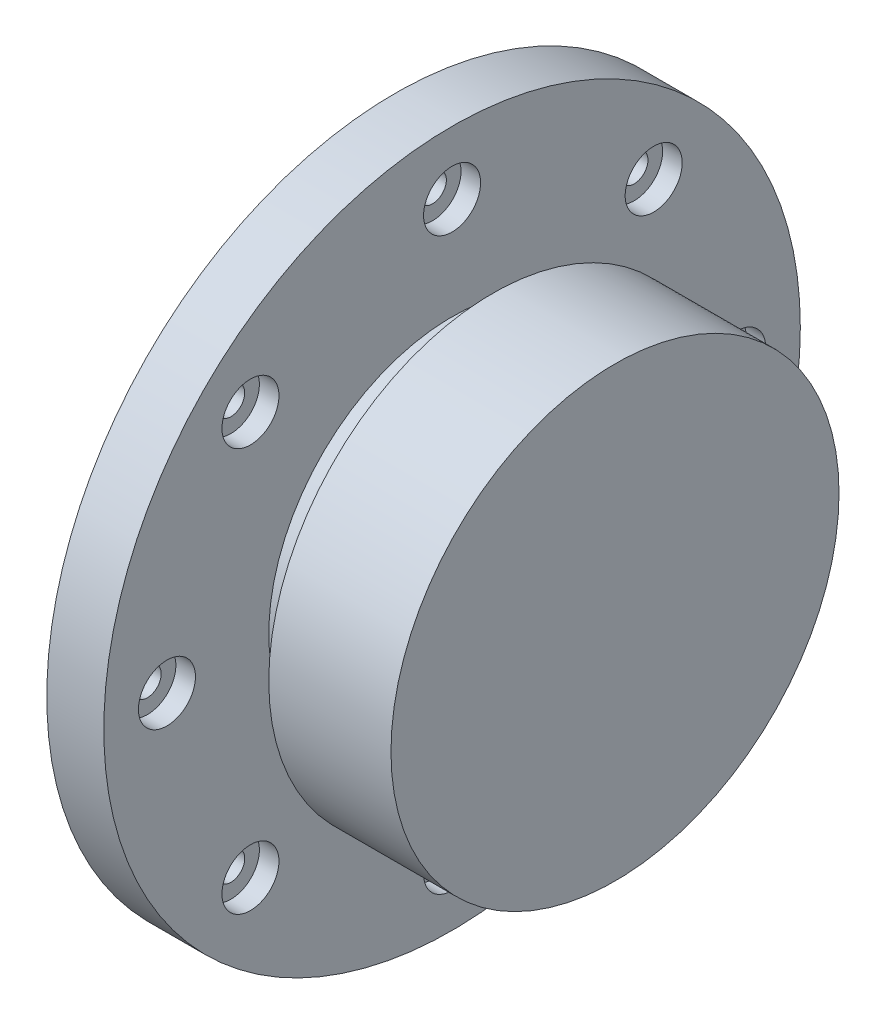
ISO-10303-21;
HEADER;
FILE_DESCRIPTION(('STEP AP214'),'2;1');
FILE_NAME('part.step','',(''),(''),'','','');
FILE_SCHEMA(('AUTOMOTIVE_DESIGN { 1 0 10303 214 1 1 1 1 }'));
ENDSEC;
DATA;
#1=APPLICATION_CONTEXT('core data for automotive mechanical design processes');
#2=APPLICATION_PROTOCOL_DEFINITION('international standard','automotive_design',2000,#1);
#3=PRODUCT_CONTEXT('',#1,'mechanical');
#4=PRODUCT('Part','Part','',(#3));
#5=PRODUCT_RELATED_PRODUCT_CATEGORY('part','',(#4));
#6=PRODUCT_DEFINITION_FORMATION('','',#4);
#7=PRODUCT_DEFINITION_CONTEXT('part definition',#1,'design');
#8=PRODUCT_DEFINITION('design','',#6,#7);
#9=PRODUCT_DEFINITION_SHAPE('','',#8);
#10=(LENGTH_UNIT() NAMED_UNIT(*) SI_UNIT(.MILLI.,.METRE.));
#11=(NAMED_UNIT(*) PLANE_ANGLE_UNIT() SI_UNIT($,.RADIAN.));
#12=(NAMED_UNIT(*) SI_UNIT($,.STERADIAN.) SOLID_ANGLE_UNIT());
#13=UNCERTAINTY_MEASURE_WITH_UNIT(LENGTH_MEASURE(1.E-05),#10,'distance_accuracy_value','');
#14=(GEOMETRIC_REPRESENTATION_CONTEXT(3) GLOBAL_UNCERTAINTY_ASSIGNED_CONTEXT((#13)) GLOBAL_UNIT_ASSIGNED_CONTEXT((#10,
#11,#12)) REPRESENTATION_CONTEXT('',''));
#15=CARTESIAN_POINT('',(0.,0.,0.));
#16=DIRECTION('',(0.,0.,1.));
#17=DIRECTION('',(1.,0.,0.));
#18=AXIS2_PLACEMENT_3D('',#15,#16,#17);
#19=CARTESIAN_POINT('',(3.5,0.,0.));
#20=DIRECTION('',(-1.,0.,0.));
#21=DIRECTION('',(0.,0.,1.));
#22=AXIS2_PLACEMENT_3D('',#19,#20,#21);
#23=CYLINDRICAL_SURFACE('',#22,42.75);
#24=CARTESIAN_POINT('',(3.5,0.,0.));
#25=DIRECTION('',(1.,0.,0.));
#26=DIRECTION('',(0.,0.,-1.));
#27=AXIS2_PLACEMENT_3D('',#24,#25,#26);
#28=CIRCLE('',#27,42.75);
#29=CARTESIAN_POINT('',(3.5,0.,-42.75));
#30=VERTEX_POINT('',#29);
#31=EDGE_CURVE('E10',#30,#30,#28,.T.);
#32=ORIENTED_EDGE('',*,*,#31,.F.);
#33=EDGE_LOOP('',(#32));
#34=FACE_BOUND('',#33,.T.);
#35=CARTESIAN_POINT('',(-3.5,0.,0.));
#36=DIRECTION('',(1.,0.,0.));
#37=DIRECTION('',(0.,0.,-1.));
#38=AXIS2_PLACEMENT_3D('',#35,#36,#37);
#39=CIRCLE('',#38,42.75);
#40=CARTESIAN_POINT('',(-3.5,0.,-42.75));
#41=VERTEX_POINT('',#40);
#42=EDGE_CURVE('E38',#41,#41,#39,.T.);
#43=ORIENTED_EDGE('',*,*,#42,.T.);
#44=EDGE_LOOP('',(#43));
#45=FACE_BOUND('',#44,.T.);
#46=ADVANCED_FACE('F31',(#34,#45),#23,.T.);
#47=CARTESIAN_POINT('',(3.5,0.,0.));
#48=DIRECTION('',(1.,0.,0.));
#49=DIRECTION('',(0.,0.,-1.));
#50=AXIS2_PLACEMENT_3D('',#47,#48,#49);
#51=PLANE('',#50);
#52=CARTESIAN_POINT('',(3.5,0.,0.));
#53=DIRECTION('',(1.,0.,0.));
#54=DIRECTION('',(0.,0.,-1.));
#55=AXIS2_PLACEMENT_3D('',#52,#53,#54);
#56=CIRCLE('',#55,22.5);
#57=CARTESIAN_POINT('',(3.5,0.,-22.5));
#58=VERTEX_POINT('',#57);
#59=EDGE_CURVE('E285',#58,#58,#56,.T.);
#60=ORIENTED_EDGE('',*,*,#59,.F.);
#61=EDGE_LOOP('',(#60));
#62=FACE_BOUND('',#61,.T.);
#63=CARTESIAN_POINT('',(3.5,35.,0.));
#64=DIRECTION('',(1.,0.,0.));
#65=DIRECTION('',(0.,0.,-1.));
#66=AXIS2_PLACEMENT_3D('',#63,#64,#65);
#67=CIRCLE('',#66,3.5);
#68=CARTESIAN_POINT('',(3.5,35.,-3.5));
#69=VERTEX_POINT('',#68);
#70=EDGE_CURVE('E295',#69,#69,#67,.T.);
#71=ORIENTED_EDGE('',*,*,#70,.F.);
#72=EDGE_LOOP('',(#71));
#73=FACE_BOUND('',#72,.T.);
#74=CARTESIAN_POINT('',(3.5,24.7487373415302,-24.7487373415299));
#75=DIRECTION('',(1.,0.,0.));
#76=DIRECTION('',(0.,0.,-1.));
#77=AXIS2_PLACEMENT_3D('',#74,#75,#76);
#78=CIRCLE('',#77,3.5);
#79=CARTESIAN_POINT('',(3.5,24.7487373415302,-28.2487373415299));
#80=VERTEX_POINT('',#79);
#81=EDGE_CURVE('E90',#80,#80,#78,.T.);
#82=ORIENTED_EDGE('',*,*,#81,.F.);
#83=EDGE_LOOP('',(#82));
#84=FACE_BOUND('',#83,.T.);
#85=CARTESIAN_POINT('',(3.5,1.60114976832659E-12,-35.0000000000013));
#86=DIRECTION('',(1.,0.,0.));
#87=DIRECTION('',(0.,0.,-1.));
#88=AXIS2_PLACEMENT_3D('',#85,#86,#87);
#89=CIRCLE('',#88,3.5);
#90=CARTESIAN_POINT('',(3.5,1.60114976832659E-12,-38.5000000000013));
#91=VERTEX_POINT('',#90);
#92=EDGE_CURVE('E77',#91,#91,#89,.T.);
#93=ORIENTED_EDGE('',*,*,#92,.F.);
#94=EDGE_LOOP('',(#93));
#95=FACE_BOUND('',#94,.T.);
#96=CARTESIAN_POINT('',(3.5,-24.7487373415281,-24.7487373415317));
#97=DIRECTION('',(1.,0.,0.));
#98=DIRECTION('',(0.,0.,-1.));
#99=AXIS2_PLACEMENT_3D('',#96,#97,#98);
#100=CIRCLE('',#99,3.5);
#101=CARTESIAN_POINT('',(3.5,-24.7487373415281,-28.2487373415317));
#102=VERTEX_POINT('',#101);
#103=EDGE_CURVE('E73',#102,#102,#100,.T.);
#104=ORIENTED_EDGE('',*,*,#103,.F.);
#105=EDGE_LOOP('',(#104));
#106=FACE_BOUND('',#105,.T.);
#107=CARTESIAN_POINT('',(3.5,-35.,-2.97142069880137E-12));
#108=DIRECTION('',(1.,0.,0.));
#109=DIRECTION('',(0.,0.,-1.));
#110=AXIS2_PLACEMENT_3D('',#107,#108,#109);
#111=CIRCLE('',#110,3.5);
#112=CARTESIAN_POINT('',(3.5,-35.,-3.50000000000297));
#113=VERTEX_POINT('',#112);
#114=EDGE_CURVE('E69',#113,#113,#111,.T.);
#115=ORIENTED_EDGE('',*,*,#114,.F.);
#116=EDGE_LOOP('',(#115));
#117=FACE_BOUND('',#116,.T.);
#118=CARTESIAN_POINT('',(3.5,-24.7487373415302,24.7487373415266));
#119=DIRECTION('',(1.,0.,0.));
#120=DIRECTION('',(0.,0.,-1.));
#121=AXIS2_PLACEMENT_3D('',#118,#119,#120);
#122=CIRCLE('',#121,3.5);
#123=CARTESIAN_POINT('',(3.5,-24.7487373415302,21.2487373415266));
#124=VERTEX_POINT('',#123);
#125=EDGE_CURVE('E64',#124,#124,#122,.T.);
#126=ORIENTED_EDGE('',*,*,#125,.F.);
#127=EDGE_LOOP('',(#126));
#128=FACE_BOUND('',#127,.T.);
#129=CARTESIAN_POINT('',(3.5,-1.4899966131977E-12,34.9999999999985));
#130=DIRECTION('',(1.,0.,0.));
#131=DIRECTION('',(0.,0.,-1.));
#132=AXIS2_PLACEMENT_3D('',#129,#130,#131);
#133=CIRCLE('',#132,3.5);
#134=CARTESIAN_POINT('',(3.5,-1.4899966131977E-12,31.4999999999985));
#135=VERTEX_POINT('',#134);
#136=EDGE_CURVE('E59',#135,#135,#133,.T.);
#137=ORIENTED_EDGE('',*,*,#136,.F.);
#138=EDGE_LOOP('',(#137));
#139=FACE_BOUND('',#138,.T.);
#140=CARTESIAN_POINT('',(3.5,24.7487373415281,24.7487373415287));
#141=DIRECTION('',(1.,0.,0.));
#142=DIRECTION('',(0.,0.,-1.));
#143=AXIS2_PLACEMENT_3D('',#140,#141,#142);
#144=CIRCLE('',#143,3.5);
#145=CARTESIAN_POINT('',(3.5,24.7487373415281,21.2487373415287));
#146=VERTEX_POINT('',#145);
#147=EDGE_CURVE('E54',#146,#146,#144,.T.);
#148=ORIENTED_EDGE('',*,*,#147,.F.);
#149=EDGE_LOOP('',(#148));
#150=FACE_BOUND('',#149,.T.);
#151=ORIENTED_EDGE('',*,*,#31,.T.);
#152=EDGE_LOOP('',(#151));
#153=FACE_BOUND('',#152,.T.);
#154=ADVANCED_FACE('F151',(#62,#73,#84,#95,#106,#117,#128,#139,#150,#153),#51,.T.);
#155=CARTESIAN_POINT('',(-3.5,0.,0.));
#156=DIRECTION('',(1.,0.,0.));
#157=DIRECTION('',(0.,0.,-1.));
#158=AXIS2_PLACEMENT_3D('',#155,#156,#157);
#159=PLANE('',#158);
#160=CARTESIAN_POINT('',(-3.5,35.,0.));
#161=DIRECTION('',(1.,0.,0.));
#162=DIRECTION('',(0.,0.,-1.));
#163=AXIS2_PLACEMENT_3D('',#160,#161,#162);
#164=CIRCLE('',#163,1.7);
#165=CARTESIAN_POINT('',(-3.5,35.,-1.7));
#166=VERTEX_POINT('',#165);
#167=EDGE_CURVE('E34',#166,#166,#164,.T.);
#168=ORIENTED_EDGE('',*,*,#167,.T.);
#169=EDGE_LOOP('',(#168));
#170=FACE_BOUND('',#169,.T.);
#171=CARTESIAN_POINT('',(-3.5,24.7487373415302,-24.7487373415299));
#172=DIRECTION('',(1.,0.,0.));
#173=DIRECTION('',(0.,0.,-1.));
#174=AXIS2_PLACEMENT_3D('',#171,#172,#173);
#175=CIRCLE('',#174,1.69999999999999);
#176=CARTESIAN_POINT('',(-3.5,24.7487373415302,-26.4487373415299));
#177=VERTEX_POINT('',#176);
#178=EDGE_CURVE('E75',#177,#177,#175,.T.);
#179=ORIENTED_EDGE('',*,*,#178,.T.);
#180=EDGE_LOOP('',(#179));
#181=FACE_BOUND('',#180,.T.);
#182=CARTESIAN_POINT('',(-3.5,1.60114976832659E-12,-35.0000000000013));
#183=DIRECTION('',(1.,0.,0.));
#184=DIRECTION('',(0.,0.,-1.));
#185=AXIS2_PLACEMENT_3D('',#182,#183,#184);
#186=CIRCLE('',#185,1.7);
#187=CARTESIAN_POINT('',(-3.5,1.60114976832659E-12,-36.7000000000013));
#188=VERTEX_POINT('',#187);
#189=EDGE_CURVE('E71',#188,#188,#186,.T.);
#190=ORIENTED_EDGE('',*,*,#189,.T.);
#191=EDGE_LOOP('',(#190));
#192=FACE_BOUND('',#191,.T.);
#193=CARTESIAN_POINT('',(-3.5,-24.7487373415281,-24.7487373415317));
#194=DIRECTION('',(1.,0.,0.));
#195=DIRECTION('',(0.,0.,-1.));
#196=AXIS2_PLACEMENT_3D('',#193,#194,#195);
#197=CIRCLE('',#196,1.7);
#198=CARTESIAN_POINT('',(-3.5,-24.7487373415281,-26.4487373415317));
#199=VERTEX_POINT('',#198);
#200=EDGE_CURVE('E66',#199,#199,#197,.T.);
#201=ORIENTED_EDGE('',*,*,#200,.T.);
#202=EDGE_LOOP('',(#201));
#203=FACE_BOUND('',#202,.T.);
#204=CARTESIAN_POINT('',(-3.5,-35.,-2.97142069880137E-12));
#205=DIRECTION('',(1.,0.,0.));
#206=DIRECTION('',(0.,0.,-1.));
#207=AXIS2_PLACEMENT_3D('',#204,#205,#206);
#208=CIRCLE('',#207,1.7);
#209=CARTESIAN_POINT('',(-3.5,-35.,-1.70000000000297));
#210=VERTEX_POINT('',#209);
#211=EDGE_CURVE('E61',#210,#210,#208,.T.);
#212=ORIENTED_EDGE('',*,*,#211,.T.);
#213=EDGE_LOOP('',(#212));
#214=FACE_BOUND('',#213,.T.);
#215=CARTESIAN_POINT('',(-3.5,-24.7487373415302,24.7487373415266));
#216=DIRECTION('',(1.,0.,0.));
#217=DIRECTION('',(0.,0.,-1.));
#218=AXIS2_PLACEMENT_3D('',#215,#216,#217);
#219=CIRCLE('',#218,1.69999999999999);
#220=CARTESIAN_POINT('',(-3.5,-24.7487373415302,23.0487373415266));
#221=VERTEX_POINT('',#220);
#222=EDGE_CURVE('E56',#221,#221,#219,.T.);
#223=ORIENTED_EDGE('',*,*,#222,.T.);
#224=EDGE_LOOP('',(#223));
#225=FACE_BOUND('',#224,.T.);
#226=CARTESIAN_POINT('',(-3.5,-1.4899966131977E-12,34.9999999999985));
#227=DIRECTION('',(1.,0.,0.));
#228=DIRECTION('',(0.,0.,-1.));
#229=AXIS2_PLACEMENT_3D('',#226,#227,#228);
#230=CIRCLE('',#229,1.7);
#231=CARTESIAN_POINT('',(-3.5,-1.4899966131977E-12,33.2999999999985));
#232=VERTEX_POINT('',#231);
#233=EDGE_CURVE('E51',#232,#232,#230,.T.);
#234=ORIENTED_EDGE('',*,*,#233,.T.);
#235=EDGE_LOOP('',(#234));
#236=FACE_BOUND('',#235,.T.);
#237=CARTESIAN_POINT('',(-3.5,24.7487373415281,24.7487373415287));
#238=DIRECTION('',(1.,0.,0.));
#239=DIRECTION('',(0.,0.,-1.));
#240=AXIS2_PLACEMENT_3D('',#237,#238,#239);
#241=CIRCLE('',#240,1.7);
#242=CARTESIAN_POINT('',(-3.5,24.7487373415281,23.0487373415287));
#243=VERTEX_POINT('',#242);
#244=EDGE_CURVE('E43',#243,#243,#241,.T.);
#245=ORIENTED_EDGE('',*,*,#244,.T.);
#246=EDGE_LOOP('',(#245));
#247=FACE_BOUND('',#246,.T.);
#248=ORIENTED_EDGE('',*,*,#42,.F.);
#249=EDGE_LOOP('',(#248));
#250=FACE_BOUND('',#249,.T.);
#251=ADVANCED_FACE('F148',(#170,#181,#192,#203,#214,#225,#236,#247,#250),#159,.F.);
#252=CARTESIAN_POINT('',(3.5,24.7487373415281,24.7487373415287));
#253=DIRECTION('',(1.,0.,0.));
#254=DIRECTION('',(0.,0.,-1.));
#255=AXIS2_PLACEMENT_3D('',#252,#253,#254);
#256=CYLINDRICAL_SURFACE('',#255,1.7);
#257=CARTESIAN_POINT('',(1.1,24.7487373415281,24.7487373415287));
#258=DIRECTION('',(1.,0.,0.));
#259=DIRECTION('',(0.,0.,-1.));
#260=AXIS2_PLACEMENT_3D('',#257,#258,#259);
#261=CIRCLE('',#260,1.7);
#262=CARTESIAN_POINT('',(1.1,24.7487373415281,23.0487373415287));
#263=VERTEX_POINT('',#262);
#264=EDGE_CURVE('E46',#263,#263,#261,.T.);
#265=ORIENTED_EDGE('',*,*,#264,.T.);
#266=EDGE_LOOP('',(#265));
#267=FACE_BOUND('',#266,.T.);
#268=ORIENTED_EDGE('',*,*,#244,.F.);
#269=EDGE_LOOP('',(#268));
#270=FACE_BOUND('',#269,.T.);
#271=ADVANCED_FACE('F134',(#267,#270),#256,.F.);
#272=CARTESIAN_POINT('',(1.1,26.4487373415281,24.7487373415287));
#273=DIRECTION('',(-1.,0.,0.));
#274=DIRECTION('',(0.,0.,1.));
#275=AXIS2_PLACEMENT_3D('',#272,#273,#274);
#276=PLANE('',#275);
#277=ORIENTED_EDGE('',*,*,#264,.F.);
#278=EDGE_LOOP('',(#277));
#279=FACE_BOUND('',#278,.T.);
#280=CARTESIAN_POINT('',(1.1,24.7487373415281,24.7487373415287));
#281=DIRECTION('',(1.,0.,0.));
#282=DIRECTION('',(0.,0.,-1.));
#283=AXIS2_PLACEMENT_3D('',#280,#281,#282);
#284=CIRCLE('',#283,3.5);
#285=CARTESIAN_POINT('',(1.1,24.7487373415281,21.2487373415287));
#286=VERTEX_POINT('',#285);
#287=EDGE_CURVE('E127',#286,#286,#284,.T.);
#288=ORIENTED_EDGE('',*,*,#287,.T.);
#289=EDGE_LOOP('',(#288));
#290=FACE_BOUND('',#289,.T.);
#291=ADVANCED_FACE('F137',(#279,#290),#276,.F.);
#292=CARTESIAN_POINT('',(3.5,24.7487373415281,24.7487373415287));
#293=DIRECTION('',(1.,0.,0.));
#294=DIRECTION('',(0.,0.,-1.));
#295=AXIS2_PLACEMENT_3D('',#292,#293,#294);
#296=CYLINDRICAL_SURFACE('',#295,3.5);
#297=ORIENTED_EDGE('',*,*,#287,.F.);
#298=EDGE_LOOP('',(#297));
#299=FACE_BOUND('',#298,.T.);
#300=ORIENTED_EDGE('',*,*,#147,.T.);
#301=EDGE_LOOP('',(#300));
#302=FACE_BOUND('',#301,.T.);
#303=ADVANCED_FACE('F139',(#299,#302),#296,.F.);
#304=CARTESIAN_POINT('',(3.5,-1.4899966131977E-12,34.9999999999985));
#305=DIRECTION('',(1.,0.,0.));
#306=DIRECTION('',(0.,0.,-1.));
#307=AXIS2_PLACEMENT_3D('',#304,#305,#306);
#308=CYLINDRICAL_SURFACE('',#307,1.7);
#309=CARTESIAN_POINT('',(1.1,-1.4899966131977E-12,34.9999999999985));
#310=DIRECTION('',(1.,0.,0.));
#311=DIRECTION('',(0.,0.,-1.));
#312=AXIS2_PLACEMENT_3D('',#309,#310,#311);
#313=CIRCLE('',#312,1.7);
#314=CARTESIAN_POINT('',(1.1,-1.4899966131977E-12,33.2999999999985));
#315=VERTEX_POINT('',#314);
#316=EDGE_CURVE('E55',#315,#315,#313,.T.);
#317=ORIENTED_EDGE('',*,*,#316,.T.);
#318=EDGE_LOOP('',(#317));
#319=FACE_BOUND('',#318,.T.);
#320=ORIENTED_EDGE('',*,*,#233,.F.);
#321=EDGE_LOOP('',(#320));
#322=FACE_BOUND('',#321,.T.);
#323=ADVANCED_FACE('F145',(#319,#322),#308,.F.);
#324=CARTESIAN_POINT('',(1.1,1.69999999999851,34.9999999999985));
#325=DIRECTION('',(-1.,0.,0.));
#326=DIRECTION('',(0.,0.,1.));
#327=AXIS2_PLACEMENT_3D('',#324,#325,#326);
#328=PLANE('',#327);
#329=ORIENTED_EDGE('',*,*,#316,.F.);
#330=EDGE_LOOP('',(#329));
#331=FACE_BOUND('',#330,.T.);
#332=CARTESIAN_POINT('',(1.1,-1.4899966131977E-12,34.9999999999985));
#333=DIRECTION('',(1.,0.,0.));
#334=DIRECTION('',(0.,0.,-1.));
#335=AXIS2_PLACEMENT_3D('',#332,#333,#334);
#336=CIRCLE('',#335,3.5);
#337=CARTESIAN_POINT('',(1.1,-1.4899966131977E-12,31.4999999999985));
#338=VERTEX_POINT('',#337);
#339=EDGE_CURVE('E121',#338,#338,#336,.T.);
#340=ORIENTED_EDGE('',*,*,#339,.T.);
#341=EDGE_LOOP('',(#340));
#342=FACE_BOUND('',#341,.T.);
#343=ADVANCED_FACE('F181',(#331,#342),#328,.F.);
#344=CARTESIAN_POINT('',(3.5,-1.4899966131977E-12,34.9999999999985));
#345=DIRECTION('',(1.,0.,0.));
#346=DIRECTION('',(0.,0.,-1.));
#347=AXIS2_PLACEMENT_3D('',#344,#345,#346);
#348=CYLINDRICAL_SURFACE('',#347,3.5);
#349=ORIENTED_EDGE('',*,*,#339,.F.);
#350=EDGE_LOOP('',(#349));
#351=FACE_BOUND('',#350,.T.);
#352=ORIENTED_EDGE('',*,*,#136,.T.);
#353=EDGE_LOOP('',(#352));
#354=FACE_BOUND('',#353,.T.);
#355=ADVANCED_FACE('F187',(#351,#354),#348,.F.);
#356=CARTESIAN_POINT('',(3.5,-24.7487373415302,24.7487373415266));
#357=DIRECTION('',(1.,0.,0.));
#358=DIRECTION('',(0.,0.,-1.));
#359=AXIS2_PLACEMENT_3D('',#356,#357,#358);
#360=CYLINDRICAL_SURFACE('',#359,1.69999999999999);
#361=CARTESIAN_POINT('',(1.1,-24.7487373415302,24.7487373415266));
#362=DIRECTION('',(1.,0.,0.));
#363=DIRECTION('',(0.,0.,-1.));
#364=AXIS2_PLACEMENT_3D('',#361,#362,#363);
#365=CIRCLE('',#364,1.7);
#366=CARTESIAN_POINT('',(1.1,-24.7487373415302,23.0487373415266));
#367=VERTEX_POINT('',#366);
#368=EDGE_CURVE('E60',#367,#367,#365,.T.);
#369=ORIENTED_EDGE('',*,*,#368,.T.);
#370=EDGE_LOOP('',(#369));
#371=FACE_BOUND('',#370,.T.);
#372=ORIENTED_EDGE('',*,*,#222,.F.);
#373=EDGE_LOOP('',(#372));
#374=FACE_BOUND('',#373,.T.);
#375=ADVANCED_FACE('F193',(#371,#374),#360,.F.);
#376=CARTESIAN_POINT('',(1.1,-23.0487373415302,24.7487373415266));
#377=DIRECTION('',(-1.,0.,0.));
#378=DIRECTION('',(0.,0.,1.));
#379=AXIS2_PLACEMENT_3D('',#376,#377,#378);
#380=PLANE('',#379);
#381=ORIENTED_EDGE('',*,*,#368,.F.);
#382=EDGE_LOOP('',(#381));
#383=FACE_BOUND('',#382,.T.);
#384=CARTESIAN_POINT('',(1.1,-24.7487373415302,24.7487373415266));
#385=DIRECTION('',(1.,0.,0.));
#386=DIRECTION('',(0.,0.,-1.));
#387=AXIS2_PLACEMENT_3D('',#384,#385,#386);
#388=CIRCLE('',#387,3.5);
#389=CARTESIAN_POINT('',(1.1,-24.7487373415302,21.2487373415266));
#390=VERTEX_POINT('',#389);
#391=EDGE_CURVE('E114',#390,#390,#388,.T.);
#392=ORIENTED_EDGE('',*,*,#391,.T.);
#393=EDGE_LOOP('',(#392));
#394=FACE_BOUND('',#393,.T.);
#395=ADVANCED_FACE('F197',(#383,#394),#380,.F.);
#396=CARTESIAN_POINT('',(3.5,-24.7487373415302,24.7487373415266));
#397=DIRECTION('',(1.,0.,0.));
#398=DIRECTION('',(0.,0.,-1.));
#399=AXIS2_PLACEMENT_3D('',#396,#397,#398);
#400=CYLINDRICAL_SURFACE('',#399,3.5);
#401=ORIENTED_EDGE('',*,*,#391,.F.);
#402=EDGE_LOOP('',(#401));
#403=FACE_BOUND('',#402,.T.);
#404=ORIENTED_EDGE('',*,*,#125,.T.);
#405=EDGE_LOOP('',(#404));
#406=FACE_BOUND('',#405,.T.);
#407=ADVANCED_FACE('F201',(#403,#406),#400,.F.);
#408=CARTESIAN_POINT('',(3.5,-35.,-2.97142069880137E-12));
#409=DIRECTION('',(1.,0.,0.));
#410=DIRECTION('',(0.,0.,-1.));
#411=AXIS2_PLACEMENT_3D('',#408,#409,#410);
#412=CYLINDRICAL_SURFACE('',#411,1.7);
#413=CARTESIAN_POINT('',(1.1,-35.,-2.97142069880137E-12));
#414=DIRECTION('',(1.,0.,0.));
#415=DIRECTION('',(0.,0.,-1.));
#416=AXIS2_PLACEMENT_3D('',#413,#414,#415);
#417=CIRCLE('',#416,1.7);
#418=CARTESIAN_POINT('',(1.1,-35.,-1.70000000000297));
#419=VERTEX_POINT('',#418);
#420=EDGE_CURVE('E65',#419,#419,#417,.T.);
#421=ORIENTED_EDGE('',*,*,#420,.T.);
#422=EDGE_LOOP('',(#421));
#423=FACE_BOUND('',#422,.T.);
#424=ORIENTED_EDGE('',*,*,#211,.F.);
#425=EDGE_LOOP('',(#424));
#426=FACE_BOUND('',#425,.T.);
#427=ADVANCED_FACE('F205',(#423,#426),#412,.F.);
#428=CARTESIAN_POINT('',(1.1,-33.3,-2.97142069880137E-12));
#429=DIRECTION('',(-1.,0.,0.));
#430=DIRECTION('',(0.,0.,1.));
#431=AXIS2_PLACEMENT_3D('',#428,#429,#430);
#432=PLANE('',#431);
#433=ORIENTED_EDGE('',*,*,#420,.F.);
#434=EDGE_LOOP('',(#433));
#435=FACE_BOUND('',#434,.T.);
#436=CARTESIAN_POINT('',(1.1,-35.,-2.97142069880137E-12));
#437=DIRECTION('',(1.,0.,0.));
#438=DIRECTION('',(0.,0.,-1.));
#439=AXIS2_PLACEMENT_3D('',#436,#437,#438);
#440=CIRCLE('',#439,3.5);
#441=CARTESIAN_POINT('',(1.1,-35.,-3.50000000000297));
#442=VERTEX_POINT('',#441);
#443=EDGE_CURVE('E107',#442,#442,#440,.T.);
#444=ORIENTED_EDGE('',*,*,#443,.T.);
#445=EDGE_LOOP('',(#444));
#446=FACE_BOUND('',#445,.T.);
#447=ADVANCED_FACE('F209',(#435,#446),#432,.F.);
#448=CARTESIAN_POINT('',(3.5,-35.,-2.97142069880137E-12));
#449=DIRECTION('',(1.,0.,0.));
#450=DIRECTION('',(0.,0.,-1.));
#451=AXIS2_PLACEMENT_3D('',#448,#449,#450);
#452=CYLINDRICAL_SURFACE('',#451,3.5);
#453=ORIENTED_EDGE('',*,*,#443,.F.);
#454=EDGE_LOOP('',(#453));
#455=FACE_BOUND('',#454,.T.);
#456=ORIENTED_EDGE('',*,*,#114,.T.);
#457=EDGE_LOOP('',(#456));
#458=FACE_BOUND('',#457,.T.);
#459=ADVANCED_FACE('F213',(#455,#458),#452,.F.);
#460=CARTESIAN_POINT('',(3.5,-24.7487373415281,-24.7487373415317));
#461=DIRECTION('',(1.,0.,0.));
#462=DIRECTION('',(0.,0.,-1.));
#463=AXIS2_PLACEMENT_3D('',#460,#461,#462);
#464=CYLINDRICAL_SURFACE('',#463,1.7);
#465=CARTESIAN_POINT('',(1.1,-24.7487373415281,-24.7487373415317));
#466=DIRECTION('',(1.,0.,0.));
#467=DIRECTION('',(0.,0.,-1.));
#468=AXIS2_PLACEMENT_3D('',#465,#466,#467);
#469=CIRCLE('',#468,1.7);
#470=CARTESIAN_POINT('',(1.1,-24.7487373415281,-26.4487373415317));
#471=VERTEX_POINT('',#470);
#472=EDGE_CURVE('E70',#471,#471,#469,.T.);
#473=ORIENTED_EDGE('',*,*,#472,.T.);
#474=EDGE_LOOP('',(#473));
#475=FACE_BOUND('',#474,.T.);
#476=ORIENTED_EDGE('',*,*,#200,.F.);
#477=EDGE_LOOP('',(#476));
#478=FACE_BOUND('',#477,.T.);
#479=ADVANCED_FACE('F217',(#475,#478),#464,.F.);
#480=CARTESIAN_POINT('',(1.1,-23.0487373415281,-24.7487373415317));
#481=DIRECTION('',(-1.,0.,0.));
#482=DIRECTION('',(0.,0.,1.));
#483=AXIS2_PLACEMENT_3D('',#480,#481,#482);
#484=PLANE('',#483);
#485=ORIENTED_EDGE('',*,*,#472,.F.);
#486=EDGE_LOOP('',(#485));
#487=FACE_BOUND('',#486,.T.);
#488=CARTESIAN_POINT('',(1.1,-24.7487373415281,-24.7487373415317));
#489=DIRECTION('',(1.,0.,0.));
#490=DIRECTION('',(0.,0.,-1.));
#491=AXIS2_PLACEMENT_3D('',#488,#489,#490);
#492=CIRCLE('',#491,3.5);
#493=CARTESIAN_POINT('',(1.1,-24.7487373415281,-28.2487373415317));
#494=VERTEX_POINT('',#493);
#495=EDGE_CURVE('E100',#494,#494,#492,.T.);
#496=ORIENTED_EDGE('',*,*,#495,.T.);
#497=EDGE_LOOP('',(#496));
#498=FACE_BOUND('',#497,.T.);
#499=ADVANCED_FACE('F221',(#487,#498),#484,.F.);
#500=CARTESIAN_POINT('',(3.5,-24.7487373415281,-24.7487373415317));
#501=DIRECTION('',(1.,0.,0.));
#502=DIRECTION('',(0.,0.,-1.));
#503=AXIS2_PLACEMENT_3D('',#500,#501,#502);
#504=CYLINDRICAL_SURFACE('',#503,3.5);
#505=ORIENTED_EDGE('',*,*,#495,.F.);
#506=EDGE_LOOP('',(#505));
#507=FACE_BOUND('',#506,.T.);
#508=ORIENTED_EDGE('',*,*,#103,.T.);
#509=EDGE_LOOP('',(#508));
#510=FACE_BOUND('',#509,.T.);
#511=ADVANCED_FACE('F225',(#507,#510),#504,.F.);
#512=CARTESIAN_POINT('',(3.5,1.60114976832659E-12,-35.0000000000013));
#513=DIRECTION('',(1.,0.,0.));
#514=DIRECTION('',(0.,0.,-1.));
#515=AXIS2_PLACEMENT_3D('',#512,#513,#514);
#516=CYLINDRICAL_SURFACE('',#515,1.7);
#517=CARTESIAN_POINT('',(1.1,1.60114976832659E-12,-35.0000000000013));
#518=DIRECTION('',(1.,0.,0.));
#519=DIRECTION('',(0.,0.,-1.));
#520=AXIS2_PLACEMENT_3D('',#517,#518,#519);
#521=CIRCLE('',#520,1.7);
#522=CARTESIAN_POINT('',(1.1,1.60114976832659E-12,-36.7000000000013));
#523=VERTEX_POINT('',#522);
#524=EDGE_CURVE('E74',#523,#523,#521,.T.);
#525=ORIENTED_EDGE('',*,*,#524,.T.);
#526=EDGE_LOOP('',(#525));
#527=FACE_BOUND('',#526,.T.);
#528=ORIENTED_EDGE('',*,*,#189,.F.);
#529=EDGE_LOOP('',(#528));
#530=FACE_BOUND('',#529,.T.);
#531=ADVANCED_FACE('F229',(#527,#530),#516,.F.);
#532=CARTESIAN_POINT('',(1.1,1.7000000000016,-35.0000000000013));
#533=DIRECTION('',(-1.,0.,0.));
#534=DIRECTION('',(0.,0.,1.));
#535=AXIS2_PLACEMENT_3D('',#532,#533,#534);
#536=PLANE('',#535);
#537=ORIENTED_EDGE('',*,*,#524,.F.);
#538=EDGE_LOOP('',(#537));
#539=FACE_BOUND('',#538,.T.);
#540=CARTESIAN_POINT('',(1.1,1.60114976832659E-12,-35.0000000000013));
#541=DIRECTION('',(1.,0.,0.));
#542=DIRECTION('',(0.,0.,-1.));
#543=AXIS2_PLACEMENT_3D('',#540,#541,#542);
#544=CIRCLE('',#543,3.5);
#545=CARTESIAN_POINT('',(1.1,1.60114976832659E-12,-38.5000000000013));
#546=VERTEX_POINT('',#545);
#547=EDGE_CURVE('E82',#546,#546,#544,.T.);
#548=ORIENTED_EDGE('',*,*,#547,.T.);
#549=EDGE_LOOP('',(#548));
#550=FACE_BOUND('',#549,.T.);
#551=ADVANCED_FACE('F233',(#539,#550),#536,.F.);
#552=CARTESIAN_POINT('',(3.5,1.60114976832659E-12,-35.0000000000013));
#553=DIRECTION('',(1.,0.,0.));
#554=DIRECTION('',(0.,0.,-1.));
#555=AXIS2_PLACEMENT_3D('',#552,#553,#554);
#556=CYLINDRICAL_SURFACE('',#555,3.5);
#557=ORIENTED_EDGE('',*,*,#547,.F.);
#558=EDGE_LOOP('',(#557));
#559=FACE_BOUND('',#558,.T.);
#560=ORIENTED_EDGE('',*,*,#92,.T.);
#561=EDGE_LOOP('',(#560));
#562=FACE_BOUND('',#561,.T.);
#563=ADVANCED_FACE('F237',(#559,#562),#556,.F.);
#564=CARTESIAN_POINT('',(3.5,24.7487373415302,-24.7487373415299));
#565=DIRECTION('',(1.,0.,0.));
#566=DIRECTION('',(0.,0.,-1.));
#567=AXIS2_PLACEMENT_3D('',#564,#565,#566);
#568=CYLINDRICAL_SURFACE('',#567,1.69999999999999);
#569=CARTESIAN_POINT('',(1.1,24.7487373415302,-24.7487373415299));
#570=DIRECTION('',(1.,0.,0.));
#571=DIRECTION('',(0.,0.,-1.));
#572=AXIS2_PLACEMENT_3D('',#569,#570,#571);
#573=CIRCLE('',#572,1.7);
#574=CARTESIAN_POINT('',(1.1,24.7487373415302,-26.4487373415299));
#575=VERTEX_POINT('',#574);
#576=EDGE_CURVE('E78',#575,#575,#573,.T.);
#577=ORIENTED_EDGE('',*,*,#576,.T.);
#578=EDGE_LOOP('',(#577));
#579=FACE_BOUND('',#578,.T.);
#580=ORIENTED_EDGE('',*,*,#178,.F.);
#581=EDGE_LOOP('',(#580));
#582=FACE_BOUND('',#581,.T.);
#583=ADVANCED_FACE('F241',(#579,#582),#568,.F.);
#584=CARTESIAN_POINT('',(1.1,26.4487373415302,-24.7487373415299));
#585=DIRECTION('',(-1.,0.,0.));
#586=DIRECTION('',(0.,0.,1.));
#587=AXIS2_PLACEMENT_3D('',#584,#585,#586);
#588=PLANE('',#587);
#589=ORIENTED_EDGE('',*,*,#576,.F.);
#590=EDGE_LOOP('',(#589));
#591=FACE_BOUND('',#590,.T.);
#592=CARTESIAN_POINT('',(1.1,24.7487373415302,-24.7487373415299));
#593=DIRECTION('',(1.,0.,0.));
#594=DIRECTION('',(0.,0.,-1.));
#595=AXIS2_PLACEMENT_3D('',#592,#593,#594);
#596=CIRCLE('',#595,3.5);
#597=CARTESIAN_POINT('',(1.1,24.7487373415302,-28.2487373415299));
#598=VERTEX_POINT('',#597);
#599=EDGE_CURVE('E85',#598,#598,#596,.T.);
#600=ORIENTED_EDGE('',*,*,#599,.T.);
#601=EDGE_LOOP('',(#600));
#602=FACE_BOUND('',#601,.T.);
#603=ADVANCED_FACE('F245',(#591,#602),#588,.F.);
#604=CARTESIAN_POINT('',(3.5,24.7487373415302,-24.7487373415299));
#605=DIRECTION('',(1.,0.,0.));
#606=DIRECTION('',(0.,0.,-1.));
#607=AXIS2_PLACEMENT_3D('',#604,#605,#606);
#608=CYLINDRICAL_SURFACE('',#607,3.5);
#609=ORIENTED_EDGE('',*,*,#599,.F.);
#610=EDGE_LOOP('',(#609));
#611=FACE_BOUND('',#610,.T.);
#612=ORIENTED_EDGE('',*,*,#81,.T.);
#613=EDGE_LOOP('',(#612));
#614=FACE_BOUND('',#613,.T.);
#615=ADVANCED_FACE('F248',(#611,#614),#608,.F.);
#616=CARTESIAN_POINT('',(3.5,35.,0.));
#617=DIRECTION('',(1.,0.,0.));
#618=DIRECTION('',(0.,0.,-1.));
#619=AXIS2_PLACEMENT_3D('',#616,#617,#618);
#620=CYLINDRICAL_SURFACE('',#619,1.7);
#621=CARTESIAN_POINT('',(1.1,35.,0.));
#622=DIRECTION('',(1.,0.,0.));
#623=DIRECTION('',(0.,0.,-1.));
#624=AXIS2_PLACEMENT_3D('',#621,#622,#623);
#625=CIRCLE('',#624,1.7);
#626=CARTESIAN_POINT('',(1.1,35.,-1.7));
#627=VERTEX_POINT('',#626);
#628=EDGE_CURVE('E302',#627,#627,#625,.T.);
#629=ORIENTED_EDGE('',*,*,#628,.T.);
#630=EDGE_LOOP('',(#629));
#631=FACE_BOUND('',#630,.T.);
#632=ORIENTED_EDGE('',*,*,#167,.F.);
#633=EDGE_LOOP('',(#632));
#634=FACE_BOUND('',#633,.T.);
#635=ADVANCED_FACE('F252',(#631,#634),#620,.F.);
#636=CARTESIAN_POINT('',(1.1,36.7,0.));
#637=DIRECTION('',(-1.,0.,0.));
#638=DIRECTION('',(0.,0.,1.));
#639=AXIS2_PLACEMENT_3D('',#636,#637,#638);
#640=PLANE('',#639);
#641=ORIENTED_EDGE('',*,*,#628,.F.);
#642=EDGE_LOOP('',(#641));
#643=FACE_BOUND('',#642,.T.);
#644=CARTESIAN_POINT('',(1.1,35.,0.));
#645=DIRECTION('',(1.,0.,0.));
#646=DIRECTION('',(0.,0.,-1.));
#647=AXIS2_PLACEMENT_3D('',#644,#645,#646);
#648=CIRCLE('',#647,3.5);
#649=CARTESIAN_POINT('',(1.1,35.,-3.5));
#650=VERTEX_POINT('',#649);
#651=EDGE_CURVE('E299',#650,#650,#648,.T.);
#652=ORIENTED_EDGE('',*,*,#651,.T.);
#653=EDGE_LOOP('',(#652));
#654=FACE_BOUND('',#653,.T.);
#655=ADVANCED_FACE('F256',(#643,#654),#640,.F.);
#656=CARTESIAN_POINT('',(3.5,35.,0.));
#657=DIRECTION('',(1.,0.,0.));
#658=DIRECTION('',(0.,0.,-1.));
#659=AXIS2_PLACEMENT_3D('',#656,#657,#658);
#660=CYLINDRICAL_SURFACE('',#659,3.5);
#661=ORIENTED_EDGE('',*,*,#651,.F.);
#662=EDGE_LOOP('',(#661));
#663=FACE_BOUND('',#662,.T.);
#664=ORIENTED_EDGE('',*,*,#70,.T.);
#665=EDGE_LOOP('',(#664));
#666=FACE_BOUND('',#665,.T.);
#667=ADVANCED_FACE('F260',(#663,#666),#660,.F.);
#668=CARTESIAN_POINT('',(8.5,0.,0.));
#669=DIRECTION('',(-1.,0.,0.));
#670=DIRECTION('',(0.,0.,1.));
#671=AXIS2_PLACEMENT_3D('',#668,#669,#670);
#672=CYLINDRICAL_SURFACE('',#671,22.5);
#673=CARTESIAN_POINT('',(8.5,0.,0.));
#674=DIRECTION('',(1.,0.,0.));
#675=DIRECTION('',(0.,0.,-1.));
#676=AXIS2_PLACEMENT_3D('',#673,#674,#675);
#677=CIRCLE('',#676,22.5);
#678=CARTESIAN_POINT('',(8.5,0.,-22.5));
#679=VERTEX_POINT('',#678);
#680=EDGE_CURVE('E289',#679,#679,#677,.T.);
#681=ORIENTED_EDGE('',*,*,#680,.F.);
#682=EDGE_LOOP('',(#681));
#683=FACE_BOUND('',#682,.T.);
#684=ORIENTED_EDGE('',*,*,#59,.T.);
#685=EDGE_LOOP('',(#684));
#686=FACE_BOUND('',#685,.T.);
#687=ADVANCED_FACE('F264',(#683,#686),#672,.T.);
#688=CARTESIAN_POINT('',(23.5,0.,0.));
#689=DIRECTION('',(-1.,0.,0.));
#690=DIRECTION('',(0.,0.,1.));
#691=AXIS2_PLACEMENT_3D('',#688,#689,#690);
#692=CYLINDRICAL_SURFACE('',#691,27.5);
#693=CARTESIAN_POINT('',(23.5,0.,0.));
#694=DIRECTION('',(1.,0.,0.));
#695=DIRECTION('',(0.,0.,-1.));
#696=AXIS2_PLACEMENT_3D('',#693,#694,#695);
#697=CIRCLE('',#696,27.5);
#698=CARTESIAN_POINT('',(23.5,0.,-27.5));
#699=VERTEX_POINT('',#698);
#700=EDGE_CURVE('E284',#699,#699,#697,.T.);
#701=ORIENTED_EDGE('',*,*,#700,.F.);
#702=EDGE_LOOP('',(#701));
#703=FACE_BOUND('',#702,.T.);
#704=CARTESIAN_POINT('',(8.5,0.,0.));
#705=DIRECTION('',(1.,0.,0.));
#706=DIRECTION('',(0.,0.,-1.));
#707=AXIS2_PLACEMENT_3D('',#704,#705,#706);
#708=CIRCLE('',#707,27.5);
#709=CARTESIAN_POINT('',(8.5,0.,-27.5));
#710=VERTEX_POINT('',#709);
#711=EDGE_CURVE('E286',#710,#710,#708,.T.);
#712=ORIENTED_EDGE('',*,*,#711,.T.);
#713=EDGE_LOOP('',(#712));
#714=FACE_BOUND('',#713,.T.);
#715=ADVANCED_FACE('F268',(#703,#714),#692,.T.);
#716=CARTESIAN_POINT('',(23.5,0.,0.));
#717=DIRECTION('',(1.,0.,0.));
#718=DIRECTION('',(0.,0.,-1.));
#719=AXIS2_PLACEMENT_3D('',#716,#717,#718);
#720=PLANE('',#719);
#721=ORIENTED_EDGE('',*,*,#700,.T.);
#722=EDGE_LOOP('',(#721));
#723=FACE_BOUND('',#722,.T.);
#724=ADVANCED_FACE('F272',(#723),#720,.T.);
#725=CARTESIAN_POINT('',(8.5,0.,0.));
#726=DIRECTION('',(1.,0.,0.));
#727=DIRECTION('',(0.,0.,-1.));
#728=AXIS2_PLACEMENT_3D('',#725,#726,#727);
#729=PLANE('',#728);
#730=ORIENTED_EDGE('',*,*,#680,.T.);
#731=EDGE_LOOP('',(#730));
#732=FACE_BOUND('',#731,.T.);
#733=ORIENTED_EDGE('',*,*,#711,.F.);
#734=EDGE_LOOP('',(#733));
#735=FACE_BOUND('',#734,.T.);
#736=ADVANCED_FACE('F274',(#732,#735),#729,.F.);
#737=CLOSED_SHELL('',(#46,#154,#251,#271,#291,#303,#323,#343,#355,#375,#395,#407,#427,#447,#459,
#479,#499,#511,#531,#551,#563,#583,#603,#615,#635,#655,#667,#687,#715,#724,#736));
#738=MANIFOLD_SOLID_BREP('B2',#737);
#739=ADVANCED_BREP_SHAPE_REPRESENTATION('',(#18,#738),#14);
#740=SHAPE_DEFINITION_REPRESENTATION(#9,#739);
ENDSEC;
END-ISO-10303-21;
